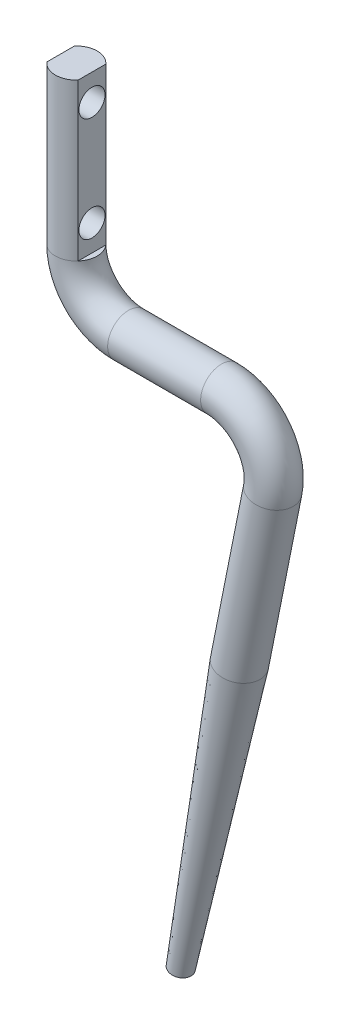
ISO-10303-21;
HEADER;
FILE_DESCRIPTION(('STEP AP214'),'2;1');
FILE_NAME('part.step','',(''),(''),'','','');
FILE_SCHEMA(('AUTOMOTIVE_DESIGN { 1 0 10303 214 1 1 1 1 }'));
ENDSEC;
DATA;
#1=APPLICATION_CONTEXT('core data for automotive mechanical design processes');
#2=APPLICATION_PROTOCOL_DEFINITION('international standard','automotive_design',2000,#1);
#3=PRODUCT_CONTEXT('',#1,'mechanical');
#4=PRODUCT('Part','Part','',(#3));
#5=PRODUCT_RELATED_PRODUCT_CATEGORY('part','',(#4));
#6=PRODUCT_DEFINITION_FORMATION('','',#4);
#7=PRODUCT_DEFINITION_CONTEXT('part definition',#1,'design');
#8=PRODUCT_DEFINITION('design','',#6,#7);
#9=PRODUCT_DEFINITION_SHAPE('','',#8);
#10=(LENGTH_UNIT() NAMED_UNIT(*) SI_UNIT(.MILLI.,.METRE.));
#11=(NAMED_UNIT(*) PLANE_ANGLE_UNIT() SI_UNIT($,.RADIAN.));
#12=(NAMED_UNIT(*) SI_UNIT($,.STERADIAN.) SOLID_ANGLE_UNIT());
#13=UNCERTAINTY_MEASURE_WITH_UNIT(LENGTH_MEASURE(1.E-05),#10,'distance_accuracy_value','');
#14=(GEOMETRIC_REPRESENTATION_CONTEXT(3) GLOBAL_UNCERTAINTY_ASSIGNED_CONTEXT((#13)) GLOBAL_UNIT_ASSIGNED_CONTEXT((#10,
#11,#12)) REPRESENTATION_CONTEXT('',''));
#15=CARTESIAN_POINT('',(0.,0.,0.));
#16=DIRECTION('',(0.,0.,1.));
#17=DIRECTION('',(1.,0.,0.));
#18=AXIS2_PLACEMENT_3D('',#15,#16,#17);
#19=CARTESIAN_POINT('',(0.,40.,0.));
#20=DIRECTION('',(0.,1.,0.));
#21=DIRECTION('',(0.,0.,1.));
#22=AXIS2_PLACEMENT_3D('',#19,#20,#21);
#23=PLANE('',#22);
#24=CARTESIAN_POINT('',(0.,40.,0.));
#25=DIRECTION('',(0.,1.,0.));
#26=DIRECTION('',(0.,0.,1.));
#27=AXIS2_PLACEMENT_3D('',#24,#25,#26);
#28=CIRCLE('',#27,4.);
#29=CARTESIAN_POINT('',(3.,40.,-2.64575131106459));
#30=VERTEX_POINT('',#29);
#31=CARTESIAN_POINT('',(-3.,40.,-2.64575131106459));
#32=VERTEX_POINT('',#31);
#33=EDGE_CURVE('E105',#30,#32,#28,.T.);
#34=ORIENTED_EDGE('',*,*,#33,.T.);
#35=DIRECTION('',(0.,0.,1.));
#36=VECTOR('',#35,1.);
#37=CARTESIAN_POINT('',(-3.,40.,-17.7651075584702));
#38=LINE('',#37,#36);
#39=CARTESIAN_POINT('',(-3.,40.,2.64575131106459));
#40=VERTEX_POINT('',#39);
#41=EDGE_CURVE('E90',#32,#40,#38,.T.);
#42=ORIENTED_EDGE('',*,*,#41,.T.);
#43=CARTESIAN_POINT('',(0.,40.,4.));
#44=VERTEX_POINT('',#43);
#45=EDGE_CURVE('E104',#40,#44,#28,.T.);
#46=ORIENTED_EDGE('',*,*,#45,.T.);
#47=CARTESIAN_POINT('',(3.,40.,2.64575131106458));
#48=VERTEX_POINT('',#47);
#49=EDGE_CURVE('E97',#44,#48,#28,.T.);
#50=ORIENTED_EDGE('',*,*,#49,.T.);
#51=DIRECTION('',(0.,0.,-1.));
#52=VECTOR('',#51,1.);
#53=CARTESIAN_POINT('',(3.,40.,-17.7651075584702));
#54=LINE('',#53,#52);
#55=EDGE_CURVE('E79',#48,#30,#54,.T.);
#56=ORIENTED_EDGE('',*,*,#55,.T.);
#57=EDGE_LOOP('',(#34,#42,#46,#50,#56));
#58=FACE_BOUND('',#57,.T.);
#59=ADVANCED_FACE('F36',(#58),#23,.T.);
#60=CARTESIAN_POINT('',(0.,40.,0.));
#61=DIRECTION('',(0.,-1.,0.));
#62=DIRECTION('',(0.,0.,-1.));
#63=AXIS2_PLACEMENT_3D('',#60,#61,#62);
#64=CYLINDRICAL_SURFACE('',#63,4.);
#65=DIRECTION('',(0.,-1.,0.));
#66=VECTOR('',#65,1.);
#67=CARTESIAN_POINT('',(-3.,40.,-2.64575131106459));
#68=LINE('',#67,#66);
#69=CARTESIAN_POINT('',(-3.,10.0000000000001,-2.64575131106459));
#70=VERTEX_POINT('',#69);
#71=EDGE_CURVE('E111',#32,#70,#68,.T.);
#72=ORIENTED_EDGE('',*,*,#71,.F.);
#73=ORIENTED_EDGE('',*,*,#33,.F.);
#74=DIRECTION('',(0.,-1.,0.));
#75=VECTOR('',#74,1.);
#76=CARTESIAN_POINT('',(3.,40.,-2.64575131106459));
#77=LINE('',#76,#75);
#78=CARTESIAN_POINT('',(3.,10.,-2.64575131106427));
#79=VERTEX_POINT('',#78);
#80=EDGE_CURVE('E85',#79,#30,#77,.F.);
#81=ORIENTED_EDGE('',*,*,#80,.F.);
#82=CARTESIAN_POINT('',(0.,10.0000000000001,0.));
#83=DIRECTION('',(0.,1.,0.));
#84=DIRECTION('',(0.,0.,1.));
#85=AXIS2_PLACEMENT_3D('',#82,#83,#84);
#86=CIRCLE('',#85,4.);
#87=EDGE_CURVE('E198',#79,#70,#86,.T.);
#88=ORIENTED_EDGE('',*,*,#87,.T.);
#89=EDGE_LOOP('',(#72,#73,#81,#88));
#90=FACE_BOUND('',#89,.T.);
#91=ADVANCED_FACE('F152',(#90),#64,.T.);
#92=DIRECTION('',(0.,-1.,0.));
#93=VECTOR('',#92,1.);
#94=CARTESIAN_POINT('',(-3.,40.,2.64575131106459));
#95=LINE('',#94,#93);
#96=CARTESIAN_POINT('',(-3.,10.,2.64575131106491));
#97=VERTEX_POINT('',#96);
#98=EDGE_CURVE('E101',#97,#40,#95,.F.);
#99=ORIENTED_EDGE('',*,*,#98,.F.);
#100=CARTESIAN_POINT('',(3.,10.0000000000001,2.64575131106459));
#101=VERTEX_POINT('',#100);
#102=EDGE_CURVE('E99',#97,#101,#86,.T.);
#103=ORIENTED_EDGE('',*,*,#102,.T.);
#104=DIRECTION('',(0.,-1.,0.));
#105=VECTOR('',#104,1.);
#106=CARTESIAN_POINT('',(3.,40.,2.64575131106459));
#107=LINE('',#106,#105);
#108=EDGE_CURVE('E82',#48,#101,#107,.T.);
#109=ORIENTED_EDGE('',*,*,#108,.F.);
#110=ORIENTED_EDGE('',*,*,#49,.F.);
#111=ORIENTED_EDGE('',*,*,#45,.F.);
#112=EDGE_LOOP('',(#99,#103,#109,#110,#111));
#113=FACE_BOUND('',#112,.T.);
#114=ADVANCED_FACE('F95',(#113),#64,.T.);
#115=CARTESIAN_POINT('',(20.,-100.,0.));
#116=DIRECTION('',(0.196116135138184,0.98058067569092,0.));
#117=DIRECTION('',(0.,0.,1.));
#118=AXIS2_PLACEMENT_3D('',#115,#116,#117);
#119=PLANE('',#118);
#120=CARTESIAN_POINT('',(20.,-100.,0.));
#121=DIRECTION('',(0.196116135138184,0.98058067569092,0.));
#122=DIRECTION('',(-0.98058067569092,0.196116135138184,0.));
#123=AXIS2_PLACEMENT_3D('',#120,#121,#122);
#124=CIRCLE('',#123,2.0000000000001);
#125=CARTESIAN_POINT('',(18.0388386486181,-99.6077677297236,0.));
#126=VERTEX_POINT('',#125);
#127=EDGE_CURVE('E12',#126,#126,#124,.F.);
#128=ORIENTED_EDGE('',*,*,#127,.T.);
#129=EDGE_LOOP('',(#128));
#130=FACE_BOUND('',#129,.T.);
#131=ADVANCED_FACE('F159',(#130),#119,.F.);
#132=CARTESIAN_POINT('',(10.,10.,0.));
#133=DIRECTION('',(0.,0.,1.));
#134=DIRECTION('',(1.,0.,0.));
#135=AXIS2_PLACEMENT_3D('',#132,#133,#134);
#136=TOROIDAL_SURFACE('',#135,10.0000000000003,4.);
#137=CARTESIAN_POINT('',(10.0000000000001,0.,0.));
#138=DIRECTION('',(-1.,0.,0.));
#139=DIRECTION('',(0.,0.,1.));
#140=AXIS2_PLACEMENT_3D('',#137,#138,#139);
#141=CIRCLE('',#140,4.);
#142=CARTESIAN_POINT('',(10.0000000000001,0.,4.));
#143=VERTEX_POINT('',#142);
#144=EDGE_CURVE('E199',#143,#143,#141,.T.);
#145=ORIENTED_EDGE('',*,*,#144,.T.);
#146=EDGE_LOOP('',(#145));
#147=FACE_BOUND('',#146,.T.);
#148=EDGE_CURVE('E109',#101,#79,#86,.T.);
#149=ORIENTED_EDGE('',*,*,#148,.F.);
#150=ORIENTED_EDGE('',*,*,#102,.F.);
#151=EDGE_CURVE('E107',#70,#97,#86,.T.);
#152=ORIENTED_EDGE('',*,*,#151,.F.);
#153=ORIENTED_EDGE('',*,*,#87,.F.);
#154=EDGE_LOOP('',(#149,#150,#152,#153));
#155=FACE_BOUND('',#154,.T.);
#156=ADVANCED_FACE('F162',(#147,#155),#136,.T.);
#157=CARTESIAN_POINT('',(10.0000000000001,0.,0.));
#158=DIRECTION('',(1.,0.,0.));
#159=DIRECTION('',(0.,0.,-1.));
#160=AXIS2_PLACEMENT_3D('',#157,#158,#159);
#161=CYLINDRICAL_SURFACE('',#160,4.);
#162=CARTESIAN_POINT('',(27.8019609728144,0.,0.));
#163=DIRECTION('',(-1.,0.,0.));
#164=DIRECTION('',(0.,0.,1.));
#165=AXIS2_PLACEMENT_3D('',#162,#163,#164);
#166=CIRCLE('',#165,4.);
#167=CARTESIAN_POINT('',(27.8019609728144,4.,0.));
#168=VERTEX_POINT('',#167);
#169=EDGE_CURVE('E201',#168,#168,#166,.T.);
#170=ORIENTED_EDGE('',*,*,#169,.T.);
#171=EDGE_LOOP('',(#170));
#172=FACE_BOUND('',#171,.T.);
#173=ORIENTED_EDGE('',*,*,#144,.F.);
#174=EDGE_LOOP('',(#173));
#175=FACE_BOUND('',#174,.T.);
#176=ADVANCED_FACE('F171',(#172,#175),#161,.T.);
#177=CARTESIAN_POINT('',(27.8019609728144,-10.,0.));
#178=DIRECTION('',(0.,0.,-1.));
#179=DIRECTION('',(-1.,0.,0.));
#180=AXIS2_PLACEMENT_3D('',#177,#178,#179);
#181=TOROIDAL_SURFACE('',#180,10.,4.);
#182=CARTESIAN_POINT('',(37.6077677297236,-11.9611613513818,0.));
#183=DIRECTION('',(0.196116135138184,0.98058067569092,0.));
#184=DIRECTION('',(0.,0.,1.));
#185=AXIS2_PLACEMENT_3D('',#182,#183,#184);
#186=CIRCLE('',#185,4.);
#187=CARTESIAN_POINT('',(41.5300904324873,-12.7456258919346,0.));
#188=VERTEX_POINT('',#187);
#189=EDGE_CURVE('E206',#188,#188,#186,.T.);
#190=CARTESIAN_POINT('',(27.8019609728144,-10.,0.));
#191=DIRECTION('',(0.,0.,-1.));
#192=DIRECTION('',(-1.,0.,0.));
#193=AXIS2_PLACEMENT_3D('',#190,#191,#192);
#194=CIRCLE('',#193,14.);
#195=EDGE_CURVE('',#168,#188,#194,.T.);
#196=ORIENTED_EDGE('',*,*,#169,.F.);
#197=ORIENTED_EDGE('',*,*,#189,.T.);
#198=ORIENTED_EDGE('',*,*,#195,.T.);
#199=ORIENTED_EDGE('',*,*,#195,.F.);
#200=EDGE_LOOP('',(#196,#198,#197,#199));
#201=FACE_BOUND('',#200,.T.);
#202=ADVANCED_FACE('F167',(#201),#181,.T.);
#203=CARTESIAN_POINT('',(37.6077677297236,-11.9611613513818,0.));
#204=DIRECTION('',(-0.196116135138184,-0.98058067569092,0.));
#205=DIRECTION('',(0.98058067569092,-0.196116135138184,0.));
#206=AXIS2_PLACEMENT_3D('',#203,#204,#205);
#207=CYLINDRICAL_SURFACE('',#206,4.);
#208=CARTESIAN_POINT('',(31.2320626373659,-43.8396868131705,0.));
#209=DIRECTION('',(0.196116135138184,0.98058067569092,0.));
#210=DIRECTION('',(-0.98058067569092,0.196116135138184,0.));
#211=AXIS2_PLACEMENT_3D('',#208,#209,#210);
#212=CIRCLE('',#211,4.);
#213=CARTESIAN_POINT('',(27.3097399346022,-43.0552222726177,0.));
#214=VERTEX_POINT('',#213);
#215=EDGE_CURVE('E44',#214,#214,#212,.T.);
#216=ORIENTED_EDGE('',*,*,#215,.T.);
#217=EDGE_LOOP('',(#216));
#218=FACE_BOUND('',#217,.T.);
#219=ORIENTED_EDGE('',*,*,#189,.F.);
#220=EDGE_LOOP('',(#219));
#221=FACE_BOUND('',#220,.T.);
#222=ADVANCED_FACE('F164',(#218,#221),#207,.T.);
#223=CARTESIAN_POINT('',(31.2320626373659,-43.8396868131705,0.));
#224=DIRECTION('',(0.196116135138184,0.98058067569092,0.));
#225=DIRECTION('',(-0.98058067569092,0.196116135138184,0.));
#226=AXIS2_PLACEMENT_3D('',#223,#224,#225);
#227=CONICAL_SURFACE('',#226,4.,0.0349065850398885);
#228=ORIENTED_EDGE('',*,*,#127,.F.);
#229=EDGE_LOOP('',(#228));
#230=FACE_BOUND('',#229,.T.);
#231=ORIENTED_EDGE('',*,*,#215,.F.);
#232=EDGE_LOOP('',(#231));
#233=FACE_BOUND('',#232,.T.);
#234=ADVANCED_FACE('F38',(#230,#233),#227,.T.);
#235=CARTESIAN_POINT('',(18.9009804864072,9.99999999999999,0.));
#236=DIRECTION('',(0.,1.,0.));
#237=DIRECTION('',(0.,0.,1.));
#238=AXIS2_PLACEMENT_3D('',#235,#236,#237);
#239=PLANE('',#238);
#240=ORIENTED_EDGE('',*,*,#151,.T.);
#241=DIRECTION('',(0.,0.,1.));
#242=VECTOR('',#241,1.);
#243=CARTESIAN_POINT('',(-3.,10.,-17.7651075584702));
#244=LINE('',#243,#242);
#245=EDGE_CURVE('E50',#70,#97,#244,.T.);
#246=ORIENTED_EDGE('',*,*,#245,.F.);
#247=EDGE_LOOP('',(#240,#246));
#248=FACE_BOUND('',#247,.T.);
#249=ADVANCED_FACE('F182',(#248),#239,.T.);
#250=CARTESIAN_POINT('',(-3.,10.,-17.7651075584702));
#251=DIRECTION('',(-1.,0.,0.));
#252=DIRECTION('',(0.,0.,1.));
#253=AXIS2_PLACEMENT_3D('',#250,#251,#252);
#254=PLANE('',#253);
#255=CARTESIAN_POINT('',(-3.,35.0000000000001,0.));
#256=DIRECTION('',(-1.,0.,0.));
#257=DIRECTION('',(0.,0.,1.));
#258=AXIS2_PLACEMENT_3D('',#255,#256,#257);
#259=CIRCLE('',#258,2.49999999999999);
#260=CARTESIAN_POINT('',(-3.,35.0000000000001,2.49999999999999));
#261=VERTEX_POINT('',#260);
#262=EDGE_CURVE('E127',#261,#261,#259,.T.);
#263=ORIENTED_EDGE('',*,*,#262,.F.);
#264=EDGE_LOOP('',(#263));
#265=FACE_BOUND('',#264,.T.);
#266=CARTESIAN_POINT('',(-3.,15.0000000000001,0.));
#267=DIRECTION('',(-1.,0.,0.));
#268=DIRECTION('',(0.,0.,1.));
#269=AXIS2_PLACEMENT_3D('',#266,#267,#268);
#270=CIRCLE('',#269,2.49999999999999);
#271=CARTESIAN_POINT('',(-3.,15.0000000000001,2.49999999999999));
#272=VERTEX_POINT('',#271);
#273=EDGE_CURVE('E119',#272,#272,#270,.T.);
#274=ORIENTED_EDGE('',*,*,#273,.F.);
#275=EDGE_LOOP('',(#274));
#276=FACE_BOUND('',#275,.T.);
#277=ORIENTED_EDGE('',*,*,#71,.T.);
#278=ORIENTED_EDGE('',*,*,#245,.T.);
#279=ORIENTED_EDGE('',*,*,#98,.T.);
#280=ORIENTED_EDGE('',*,*,#41,.F.);
#281=EDGE_LOOP('',(#277,#278,#279,#280));
#282=FACE_BOUND('',#281,.T.);
#283=ADVANCED_FACE('F181',(#265,#276,#282),#254,.T.);
#284=ORIENTED_EDGE('',*,*,#148,.T.);
#285=DIRECTION('',(0.,0.,-1.));
#286=VECTOR('',#285,1.);
#287=CARTESIAN_POINT('',(3.,10.,-17.7651075584702));
#288=LINE('',#287,#286);
#289=EDGE_CURVE('E57',#101,#79,#288,.T.);
#290=ORIENTED_EDGE('',*,*,#289,.F.);
#291=EDGE_LOOP('',(#284,#290));
#292=FACE_BOUND('',#291,.T.);
#293=ADVANCED_FACE('F139',(#292),#239,.T.);
#294=CARTESIAN_POINT('',(3.,10.,-17.7651075584702));
#295=DIRECTION('',(1.,0.,0.));
#296=DIRECTION('',(0.,0.,-1.));
#297=AXIS2_PLACEMENT_3D('',#294,#295,#296);
#298=PLANE('',#297);
#299=CARTESIAN_POINT('',(3.,35.0000000000001,0.));
#300=DIRECTION('',(1.,0.,0.));
#301=DIRECTION('',(0.,0.,-1.));
#302=AXIS2_PLACEMENT_3D('',#299,#300,#301);
#303=CIRCLE('',#302,2.49999999999999);
#304=CARTESIAN_POINT('',(3.,35.0000000000001,-2.49999999999999));
#305=VERTEX_POINT('',#304);
#306=EDGE_CURVE('E130',#305,#305,#303,.T.);
#307=ORIENTED_EDGE('',*,*,#306,.F.);
#308=EDGE_LOOP('',(#307));
#309=FACE_BOUND('',#308,.T.);
#310=CARTESIAN_POINT('',(3.,15.0000000000001,0.));
#311=DIRECTION('',(1.,0.,0.));
#312=DIRECTION('',(0.,0.,-1.));
#313=AXIS2_PLACEMENT_3D('',#310,#311,#312);
#314=CIRCLE('',#313,2.49999999999999);
#315=CARTESIAN_POINT('',(3.,15.0000000000001,-2.49999999999999));
#316=VERTEX_POINT('',#315);
#317=EDGE_CURVE('E124',#316,#316,#314,.T.);
#318=ORIENTED_EDGE('',*,*,#317,.F.);
#319=EDGE_LOOP('',(#318));
#320=FACE_BOUND('',#319,.T.);
#321=ORIENTED_EDGE('',*,*,#108,.T.);
#322=ORIENTED_EDGE('',*,*,#289,.T.);
#323=ORIENTED_EDGE('',*,*,#80,.T.);
#324=ORIENTED_EDGE('',*,*,#55,.F.);
#325=EDGE_LOOP('',(#321,#322,#323,#324));
#326=FACE_BOUND('',#325,.T.);
#327=ADVANCED_FACE('F81',(#309,#320,#326),#298,.T.);
#328=CARTESIAN_POINT('',(3.,15.0000000000001,0.));
#329=DIRECTION('',(1.,0.,0.));
#330=DIRECTION('',(0.,0.,-1.));
#331=AXIS2_PLACEMENT_3D('',#328,#329,#330);
#332=CYLINDRICAL_SURFACE('',#331,2.49999999999999);
#333=ORIENTED_EDGE('',*,*,#273,.T.);
#334=EDGE_LOOP('',(#333));
#335=FACE_BOUND('',#334,.T.);
#336=ORIENTED_EDGE('',*,*,#317,.T.);
#337=EDGE_LOOP('',(#336));
#338=FACE_BOUND('',#337,.T.);
#339=ADVANCED_FACE('F138',(#335,#338),#332,.F.);
#340=CARTESIAN_POINT('',(3.,35.0000000000001,0.));
#341=DIRECTION('',(1.,0.,0.));
#342=DIRECTION('',(0.,0.,-1.));
#343=AXIS2_PLACEMENT_3D('',#340,#341,#342);
#344=CYLINDRICAL_SURFACE('',#343,2.49999999999999);
#345=ORIENTED_EDGE('',*,*,#262,.T.);
#346=EDGE_LOOP('',(#345));
#347=FACE_BOUND('',#346,.T.);
#348=ORIENTED_EDGE('',*,*,#306,.T.);
#349=EDGE_LOOP('',(#348));
#350=FACE_BOUND('',#349,.T.);
#351=ADVANCED_FACE('F134',(#347,#350),#344,.F.);
#352=CLOSED_SHELL('',(#59,#91,#114,#131,#156,#176,#202,#222,#234,#249,#283,#293,#327,#339,#351));
#353=MANIFOLD_SOLID_BREP('B2',#352);
#354=ADVANCED_BREP_SHAPE_REPRESENTATION('',(#18,#353),#14);
#355=SHAPE_DEFINITION_REPRESENTATION(#9,#354);
ENDSEC;
END-ISO-10303-21;
